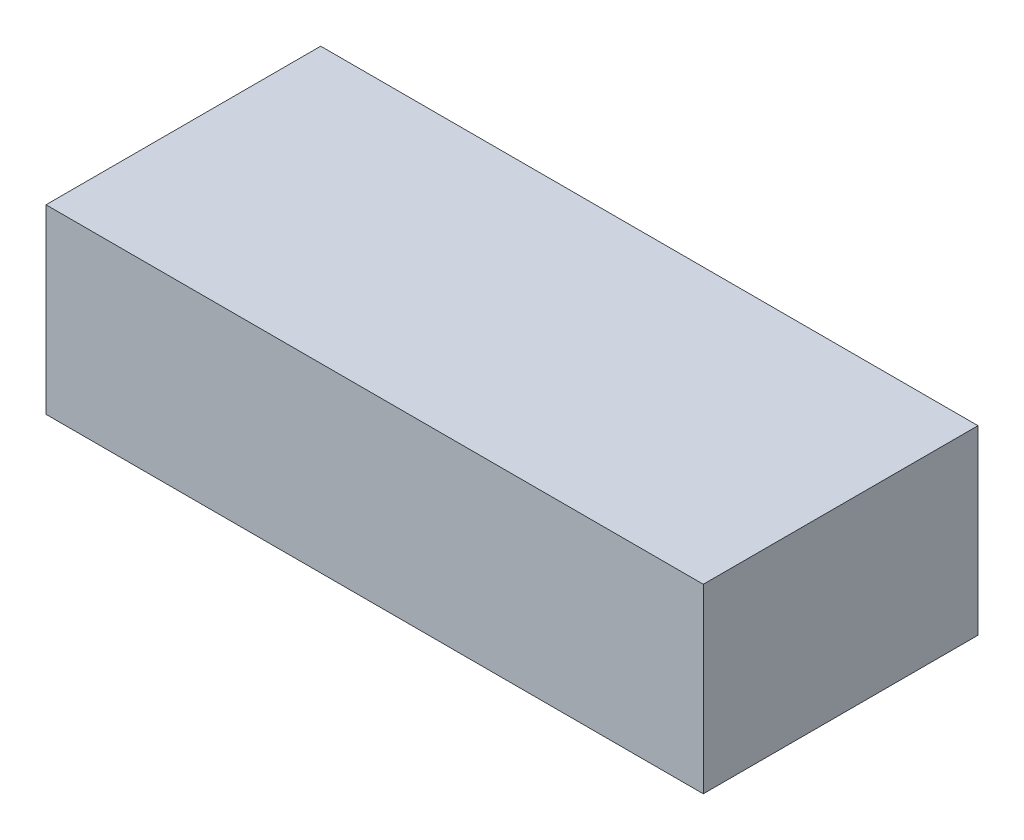
ISO-10303-21;
HEADER;
FILE_DESCRIPTION(('STEP AP214'),'2;1');
FILE_NAME('part.step','',(''),(''),'','','');
FILE_SCHEMA(('AUTOMOTIVE_DESIGN { 1 0 10303 214 1 1 1 1 }'));
ENDSEC;
DATA;
#1=APPLICATION_CONTEXT('core data for automotive mechanical design processes');
#2=APPLICATION_PROTOCOL_DEFINITION('international standard','automotive_design',2000,#1);
#3=PRODUCT_CONTEXT('',#1,'mechanical');
#4=PRODUCT('Part','Part','',(#3));
#5=PRODUCT_RELATED_PRODUCT_CATEGORY('part','',(#4));
#6=PRODUCT_DEFINITION_FORMATION('','',#4);
#7=PRODUCT_DEFINITION_CONTEXT('part definition',#1,'design');
#8=PRODUCT_DEFINITION('design','',#6,#7);
#9=PRODUCT_DEFINITION_SHAPE('','',#8);
#10=(LENGTH_UNIT() NAMED_UNIT(*) SI_UNIT(.MILLI.,.METRE.));
#11=(NAMED_UNIT(*) PLANE_ANGLE_UNIT() SI_UNIT($,.RADIAN.));
#12=(NAMED_UNIT(*) SI_UNIT($,.STERADIAN.) SOLID_ANGLE_UNIT());
#13=UNCERTAINTY_MEASURE_WITH_UNIT(LENGTH_MEASURE(1.E-05),#10,'distance_accuracy_value','');
#14=(GEOMETRIC_REPRESENTATION_CONTEXT(3) GLOBAL_UNCERTAINTY_ASSIGNED_CONTEXT((#13)) GLOBAL_UNIT_ASSIGNED_CONTEXT((#10,
#11,#12)) REPRESENTATION_CONTEXT('',''));
#15=CARTESIAN_POINT('',(0.,0.,0.));
#16=DIRECTION('',(0.,0.,1.));
#17=DIRECTION('',(1.,0.,0.));
#18=AXIS2_PLACEMENT_3D('',#15,#16,#17);
#19=CARTESIAN_POINT('',(67.,18.5,56.));
#20=DIRECTION('',(-1.,0.,0.));
#21=DIRECTION('',(0.,0.,1.));
#22=AXIS2_PLACEMENT_3D('',#19,#20,#21);
#23=PLANE('',#22);
#24=DIRECTION('',(0.,1.,0.));
#25=VECTOR('',#24,1.);
#26=CARTESIAN_POINT('',(67.,18.5,0.));
#27=LINE('',#26,#25);
#28=CARTESIAN_POINT('',(67.,-18.5,0.));
#29=VERTEX_POINT('',#28);
#30=CARTESIAN_POINT('',(67.,18.5,0.));
#31=VERTEX_POINT('',#30);
#32=EDGE_CURVE('E110',#29,#31,#27,.T.);
#33=ORIENTED_EDGE('',*,*,#32,.T.);
#34=DIRECTION('',(0.,0.,-1.));
#35=VECTOR('',#34,1.);
#36=CARTESIAN_POINT('',(67.,18.5,56.));
#37=LINE('',#36,#35);
#38=CARTESIAN_POINT('',(67.,18.5,56.));
#39=VERTEX_POINT('',#38);
#40=EDGE_CURVE('E11',#39,#31,#37,.T.);
#41=ORIENTED_EDGE('',*,*,#40,.F.);
#42=DIRECTION('',(0.,1.,0.));
#43=VECTOR('',#42,1.);
#44=CARTESIAN_POINT('',(67.,18.5,56.));
#45=LINE('',#44,#43);
#46=CARTESIAN_POINT('',(67.,-18.5,56.));
#47=VERTEX_POINT('',#46);
#48=EDGE_CURVE('E98',#47,#39,#45,.T.);
#49=ORIENTED_EDGE('',*,*,#48,.F.);
#50=DIRECTION('',(0.,0.,-1.));
#51=VECTOR('',#50,1.);
#52=CARTESIAN_POINT('',(67.,-18.5,56.));
#53=LINE('',#52,#51);
#54=EDGE_CURVE('E106',#47,#29,#53,.T.);
#55=ORIENTED_EDGE('',*,*,#54,.T.);
#56=EDGE_LOOP('',(#33,#41,#49,#55));
#57=FACE_BOUND('',#56,.T.);
#58=ADVANCED_FACE('F47',(#57),#23,.F.);
#59=CARTESIAN_POINT('',(-67.,18.5,56.));
#60=DIRECTION('',(0.,-1.,0.));
#61=DIRECTION('',(0.,0.,-1.));
#62=AXIS2_PLACEMENT_3D('',#59,#60,#61);
#63=PLANE('',#62);
#64=DIRECTION('',(-1.,0.,0.));
#65=VECTOR('',#64,1.);
#66=CARTESIAN_POINT('',(-67.,18.5,0.));
#67=LINE('',#66,#65);
#68=CARTESIAN_POINT('',(-67.,18.5,0.));
#69=VERTEX_POINT('',#68);
#70=EDGE_CURVE('E102',#31,#69,#67,.T.);
#71=ORIENTED_EDGE('',*,*,#70,.T.);
#72=DIRECTION('',(0.,0.,-1.));
#73=VECTOR('',#72,1.);
#74=CARTESIAN_POINT('',(-67.,18.5,56.));
#75=LINE('',#74,#73);
#76=CARTESIAN_POINT('',(-67.,18.5,56.));
#77=VERTEX_POINT('',#76);
#78=EDGE_CURVE('E55',#77,#69,#75,.T.);
#79=ORIENTED_EDGE('',*,*,#78,.F.);
#80=DIRECTION('',(-1.,0.,0.));
#81=VECTOR('',#80,1.);
#82=CARTESIAN_POINT('',(-67.,18.5,56.));
#83=LINE('',#82,#81);
#84=EDGE_CURVE('E93',#39,#77,#83,.T.);
#85=ORIENTED_EDGE('',*,*,#84,.F.);
#86=ORIENTED_EDGE('',*,*,#40,.T.);
#87=EDGE_LOOP('',(#71,#79,#85,#86));
#88=FACE_BOUND('',#87,.T.);
#89=ADVANCED_FACE('F101',(#88),#63,.F.);
#90=CARTESIAN_POINT('',(-67.,18.5,56.));
#91=DIRECTION('',(1.,0.,0.));
#92=DIRECTION('',(0.,0.,-1.));
#93=AXIS2_PLACEMENT_3D('',#90,#91,#92);
#94=PLANE('',#93);
#95=DIRECTION('',(0.,-1.,0.));
#96=VECTOR('',#95,1.);
#97=CARTESIAN_POINT('',(-67.,18.5,0.));
#98=LINE('',#97,#96);
#99=CARTESIAN_POINT('',(-67.,-18.5,0.));
#100=VERTEX_POINT('',#99);
#101=EDGE_CURVE('E80',#69,#100,#98,.T.);
#102=ORIENTED_EDGE('',*,*,#101,.T.);
#103=DIRECTION('',(0.,0.,-1.));
#104=VECTOR('',#103,1.);
#105=CARTESIAN_POINT('',(-67.,-18.5,56.));
#106=LINE('',#105,#104);
#107=CARTESIAN_POINT('',(-67.,-18.5,56.));
#108=VERTEX_POINT('',#107);
#109=EDGE_CURVE('E103',#108,#100,#106,.T.);
#110=ORIENTED_EDGE('',*,*,#109,.F.);
#111=DIRECTION('',(0.,-1.,0.));
#112=VECTOR('',#111,1.);
#113=CARTESIAN_POINT('',(-67.,18.5,56.));
#114=LINE('',#113,#112);
#115=EDGE_CURVE('E96',#77,#108,#114,.T.);
#116=ORIENTED_EDGE('',*,*,#115,.F.);
#117=ORIENTED_EDGE('',*,*,#78,.T.);
#118=EDGE_LOOP('',(#102,#110,#116,#117));
#119=FACE_BOUND('',#118,.T.);
#120=ADVANCED_FACE('F104',(#119),#94,.F.);
#121=CARTESIAN_POINT('',(-67.,-18.5,56.));
#122=DIRECTION('',(0.,1.,0.));
#123=DIRECTION('',(0.,0.,1.));
#124=AXIS2_PLACEMENT_3D('',#121,#122,#123);
#125=PLANE('',#124);
#126=DIRECTION('',(1.,0.,0.));
#127=VECTOR('',#126,1.);
#128=CARTESIAN_POINT('',(-67.,-18.5,0.));
#129=LINE('',#128,#127);
#130=EDGE_CURVE('E86',#100,#29,#129,.T.);
#131=ORIENTED_EDGE('',*,*,#130,.T.);
#132=ORIENTED_EDGE('',*,*,#54,.F.);
#133=DIRECTION('',(1.,0.,0.));
#134=VECTOR('',#133,1.);
#135=CARTESIAN_POINT('',(-67.,-18.5,56.));
#136=LINE('',#135,#134);
#137=EDGE_CURVE('E63',#108,#47,#136,.T.);
#138=ORIENTED_EDGE('',*,*,#137,.F.);
#139=ORIENTED_EDGE('',*,*,#109,.T.);
#140=EDGE_LOOP('',(#131,#132,#138,#139));
#141=FACE_BOUND('',#140,.T.);
#142=ADVANCED_FACE('F117',(#141),#125,.F.);
#143=CARTESIAN_POINT('',(0.,0.,56.));
#144=DIRECTION('',(0.,0.,1.));
#145=DIRECTION('',(1.,0.,0.));
#146=AXIS2_PLACEMENT_3D('',#143,#144,#145);
#147=PLANE('',#146);
#148=ORIENTED_EDGE('',*,*,#48,.T.);
#149=ORIENTED_EDGE('',*,*,#84,.T.);
#150=ORIENTED_EDGE('',*,*,#115,.T.);
#151=ORIENTED_EDGE('',*,*,#137,.T.);
#152=EDGE_LOOP('',(#148,#149,#150,#151));
#153=FACE_BOUND('',#152,.T.);
#154=ADVANCED_FACE('F94',(#153),#147,.T.);
#155=CARTESIAN_POINT('',(0.,0.,0.));
#156=DIRECTION('',(0.,0.,1.));
#157=DIRECTION('',(1.,0.,0.));
#158=AXIS2_PLACEMENT_3D('',#155,#156,#157);
#159=PLANE('',#158);
#160=ORIENTED_EDGE('',*,*,#32,.F.);
#161=ORIENTED_EDGE('',*,*,#130,.F.);
#162=ORIENTED_EDGE('',*,*,#101,.F.);
#163=ORIENTED_EDGE('',*,*,#70,.F.);
#164=EDGE_LOOP('',(#160,#161,#162,#163));
#165=FACE_BOUND('',#164,.T.);
#166=ADVANCED_FACE('F120',(#165),#159,.F.);
#167=CLOSED_SHELL('',(#58,#89,#120,#142,#154,#166));
#168=MANIFOLD_SOLID_BREP('B2',#167);
#169=ADVANCED_BREP_SHAPE_REPRESENTATION('',(#18,#168),#14);
#170=SHAPE_DEFINITION_REPRESENTATION(#9,#169);
ENDSEC;
END-ISO-10303-21;
